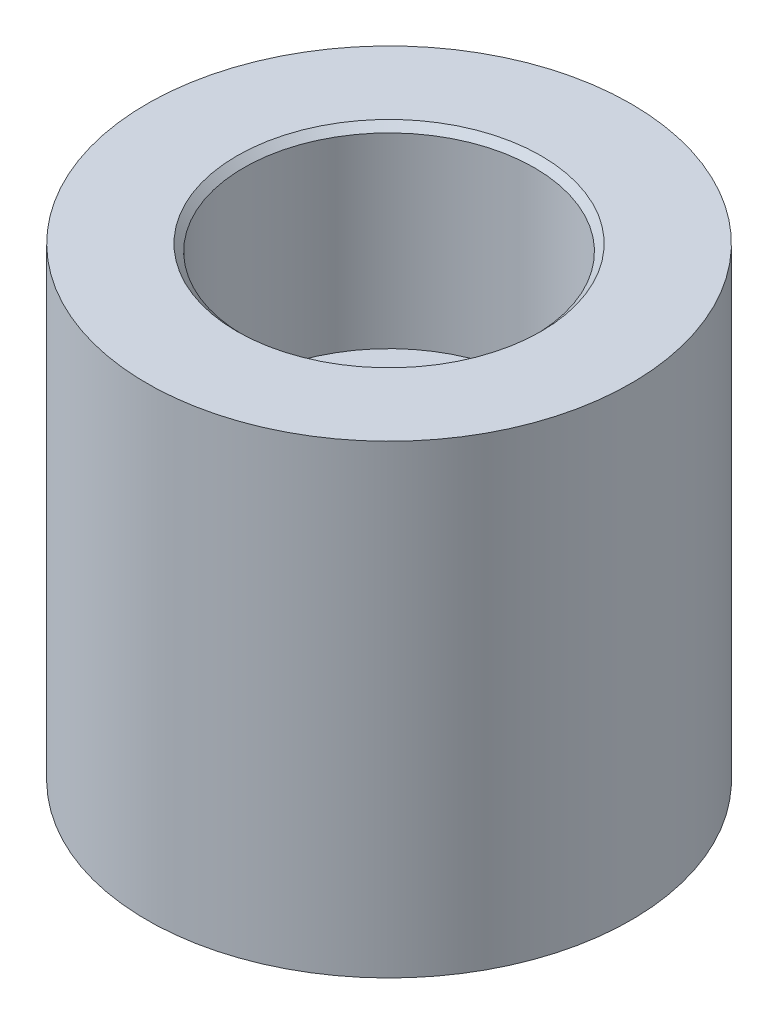
ISO-10303-21;
HEADER;
FILE_DESCRIPTION(('STEP AP214'),'2;1');
FILE_NAME('part.step','',(''),(''),'','','');
FILE_SCHEMA(('AUTOMOTIVE_DESIGN { 1 0 10303 214 1 1 1 1 }'));
ENDSEC;
DATA;
#1=APPLICATION_CONTEXT('core data for automotive mechanical design processes');
#2=APPLICATION_PROTOCOL_DEFINITION('international standard','automotive_design',2000,#1);
#3=PRODUCT_CONTEXT('',#1,'mechanical');
#4=PRODUCT('Part','Part','',(#3));
#5=PRODUCT_RELATED_PRODUCT_CATEGORY('part','',(#4));
#6=PRODUCT_DEFINITION_FORMATION('','',#4);
#7=PRODUCT_DEFINITION_CONTEXT('part definition',#1,'design');
#8=PRODUCT_DEFINITION('design','',#6,#7);
#9=PRODUCT_DEFINITION_SHAPE('','',#8);
#10=(LENGTH_UNIT() NAMED_UNIT(*) SI_UNIT(.MILLI.,.METRE.));
#11=(NAMED_UNIT(*) PLANE_ANGLE_UNIT() SI_UNIT($,.RADIAN.));
#12=(NAMED_UNIT(*) SI_UNIT($,.STERADIAN.) SOLID_ANGLE_UNIT());
#13=UNCERTAINTY_MEASURE_WITH_UNIT(LENGTH_MEASURE(1.E-05),#10,'distance_accuracy_value','');
#14=(GEOMETRIC_REPRESENTATION_CONTEXT(3) GLOBAL_UNCERTAINTY_ASSIGNED_CONTEXT((#13)) GLOBAL_UNIT_ASSIGNED_CONTEXT((#10,
#11,#12)) REPRESENTATION_CONTEXT('',''));
#15=CARTESIAN_POINT('',(0.,0.,0.));
#16=DIRECTION('',(0.,0.,1.));
#17=DIRECTION('',(1.,0.,0.));
#18=AXIS2_PLACEMENT_3D('',#15,#16,#17);
#19=CARTESIAN_POINT('',(0.,0.,0.));
#20=DIRECTION('',(0.,-1.,0.));
#21=DIRECTION('',(0.,0.,-1.));
#22=AXIS2_PLACEMENT_3D('',#19,#20,#21);
#23=PLANE('',#22);
#24=CARTESIAN_POINT('',(0.,0.,0.));
#25=DIRECTION('',(0.,-1.,0.));
#26=DIRECTION('',(0.,0.,-1.));
#27=AXIS2_PLACEMENT_3D('',#24,#25,#26);
#28=CIRCLE('',#27,3.);
#29=CARTESIAN_POINT('',(0.,0.,3.));
#30=VERTEX_POINT('',#29);
#31=EDGE_CURVE('E62',#30,#30,#28,.T.);
#32=ORIENTED_EDGE('',*,*,#31,.F.);
#33=EDGE_LOOP('',(#32));
#34=FACE_BOUND('',#33,.T.);
#35=CARTESIAN_POINT('',(0.,0.,0.));
#36=DIRECTION('',(0.,-1.,0.));
#37=DIRECTION('',(0.,0.,-1.));
#38=AXIS2_PLACEMENT_3D('',#35,#36,#37);
#39=CIRCLE('',#38,25.);
#40=CARTESIAN_POINT('',(0.,0.,-25.));
#41=VERTEX_POINT('',#40);
#42=EDGE_CURVE('E10',#41,#41,#39,.T.);
#43=ORIENTED_EDGE('',*,*,#42,.T.);
#44=EDGE_LOOP('',(#43));
#45=FACE_BOUND('',#44,.T.);
#46=ADVANCED_FACE('F32',(#34,#45),#23,.T.);
#47=CARTESIAN_POINT('',(0.,0.,0.));
#48=DIRECTION('',(0.,-1.,0.));
#49=DIRECTION('',(0.,0.,-1.));
#50=AXIS2_PLACEMENT_3D('',#47,#48,#49);
#51=CYLINDRICAL_SURFACE('',#50,25.);
#52=CARTESIAN_POINT('',(0.,25.,-25.));
#53=CARTESIAN_POINT('',(0.0561463470094441,24.9999975176159,-24.9999997313602));
#54=CARTESIAN_POINT('',(0.112332833424932,24.995255505283,-24.9998088276411));
#55=CARTESIAN_POINT('',(0.223156749052394,24.9764054068759,-24.9990656273066));
#56=CARTESIAN_POINT('',(0.27779225851355,24.9622861996402,-24.998512901589));
#57=CARTESIAN_POINT('',(0.383892729566534,24.9250857771377,-24.9971086364703));
#58=CARTESIAN_POINT('',(0.435359255781934,24.9020090262648,-24.9962572459427));
#59=CARTESIAN_POINT('',(0.533673799900105,24.8475551871666,-24.9943516214774));
#60=CARTESIAN_POINT('',(0.580522925234626,24.8161800958872,-24.9932974363577));
#61=CARTESIAN_POINT('',(0.668319730976189,24.7459953171078,-24.9911040507558));
#62=CARTESIAN_POINT('',(0.709263831785767,24.7071811529993,-24.9899647993365));
#63=CARTESIAN_POINT('',(0.784057976647897,24.6232285494857,-24.9877301253061));
#64=CARTESIAN_POINT('',(0.817907735030962,24.5780898555315,-24.9866347044614));
#65=CARTESIAN_POINT('',(0.877560633846625,24.4827527390268,-24.9846108975087));
#66=CARTESIAN_POINT('',(0.903361216107984,24.4325527145891,-24.9836825645437));
#67=CARTESIAN_POINT('',(0.946166894307623,24.3285292578572,-24.9820981836086));
#68=CARTESIAN_POINT('',(0.963172039265135,24.274705845759,-24.9814421341209));
#69=CARTESIAN_POINT('',(0.987895315988766,24.1649942522482,-24.9804767258822));
#70=CARTESIAN_POINT('',(0.995618458082538,24.1091072015744,-24.9801671800983));
#71=CARTESIAN_POINT('',(1.00157394685459,23.996829089005,-24.9799291218785));
#72=CARTESIAN_POINT('',(0.999806347602293,23.9404380299826,-24.9800006072718));
#73=CARTESIAN_POINT('',(0.986834724932466,23.828786646534,-24.9805163761421));
#74=CARTESIAN_POINT('',(0.975636113097927,23.7735256922676,-24.980960445827));
#75=CARTESIAN_POINT('',(0.944128732235828,23.6656686920144,-24.9821709906939));
#76=CARTESIAN_POINT('',(0.923819935067671,23.6130726542598,-24.9829374668716));
#77=CARTESIAN_POINT('',(0.874662475725015,23.512021054563,-24.984706674276));
#78=CARTESIAN_POINT('',(0.845811338696029,23.4635666977829,-24.9857094739521));
#79=CARTESIAN_POINT('',(0.780389994201206,23.3721870976351,-24.9878382210831));
#80=CARTESIAN_POINT('',(0.743819752971197,23.3292618784537,-24.9889641690765));
#81=CARTESIAN_POINT('',(0.663967716987967,23.2501275341749,-24.9912132459231));
#82=CARTESIAN_POINT('',(0.6206812332783,23.2139231403181,-24.9923363722453));
#83=CARTESIAN_POINT('',(0.528641967868965,23.1492945958165,-24.9944524442096));
#84=CARTESIAN_POINT('',(0.479889185106713,23.1208704466841,-24.9954453898264));
#85=CARTESIAN_POINT('',(0.378298541270231,23.0726097426589,-24.9971892059437));
#86=CARTESIAN_POINT('',(0.325460606015092,23.0527733437513,-24.9979400720472));
#87=CARTESIAN_POINT('',(0.217200734080876,23.0222542746375,-24.9991150279319));
#88=CARTESIAN_POINT('',(0.161778809820877,23.0115715604419,-24.9995391192834));
#89=CARTESIAN_POINT('',(0.0499652802237737,22.9996689161786,-25.0000125231353));
#90=CARTESIAN_POINT('',(-0.00642562727268167,22.9984424404356,-25.0000620948804));
#91=CARTESIAN_POINT('',(-0.118612500067988,23.0054700197227,-24.9997815595425));
#92=CARTESIAN_POINT('',(-0.174408466614514,23.013724054867,-24.9994514532559));
#93=CARTESIAN_POINT('',(-0.283803326228708,23.0394729368111,-24.9984489221807));
#94=CARTESIAN_POINT('',(-0.337402921674786,23.0569648041937,-24.9977766077646));
#95=CARTESIAN_POINT('',(-0.440905142316235,23.1006897999788,-24.9961653908243));
#96=CARTESIAN_POINT('',(-0.490807753993521,23.1269229603421,-24.9952264873253));
#97=CARTESIAN_POINT('',(-0.585529553929883,23.1874026937278,-24.9931871502773));
#98=CARTESIAN_POINT('',(-0.630345932241639,23.2216536645894,-24.9920866282028));
#99=CARTESIAN_POINT('',(-0.713594858215399,23.2971903167056,-24.9898483398823));
#100=CARTESIAN_POINT('',(-0.752027378818251,23.3384760277769,-24.9887105734784));
#101=CARTESIAN_POINT('',(-0.821439572007103,23.426938310698,-24.9865253115002));
#102=CARTESIAN_POINT('',(-0.852415016371307,23.4741182016762,-24.9854778673544));
#103=CARTESIAN_POINT('',(-0.906004883239562,23.5730127324744,-24.9835921606171));
#104=CARTESIAN_POINT('',(-0.928619332294777,23.6247273578932,-24.9827538973615));
#105=CARTESIAN_POINT('',(-0.964837868903378,23.7312075619123,-24.9813814381553));
#106=CARTESIAN_POINT('',(-0.978444674332901,23.7859722148159,-24.9808471504932));
#107=CARTESIAN_POINT('',(-0.99627057538689,23.8970109362245,-24.9801426284087));
#108=CARTESIAN_POINT('',(-1.00048969893352,23.9532850002394,-24.9799723929035));
#109=CARTESIAN_POINT('',(-0.999420163736354,24.0657029622006,-24.9800152025847));
#110=CARTESIAN_POINT('',(-0.994138162655541,24.121846923712,-24.9802279793854));
#111=CARTESIAN_POINT('',(-0.974230044573727,24.2324504101321,-24.9810122634766));
#112=CARTESIAN_POINT('',(-0.959603909324686,24.286909931751,-24.9815837714677));
#113=CARTESIAN_POINT('',(-0.921423905585137,24.3926004504634,-24.9830210439361));
#114=CARTESIAN_POINT('',(-0.897869916196183,24.4438314038255,-24.9838868123981));
#115=CARTESIAN_POINT('',(-0.842504329174852,24.5416113829738,-24.9858149827055));
#116=CARTESIAN_POINT('',(-0.810693010318196,24.5881605667476,-24.9868773779123));
#117=CARTESIAN_POINT('',(-0.739693250839156,24.6752880639909,-24.9890798659209));
#118=CARTESIAN_POINT('',(-0.700500445115082,24.7158628190066,-24.9902200044412));
#119=CARTESIAN_POINT('',(-0.615847951555446,24.789868531044,-24.9924492609827));
#120=CARTESIAN_POINT('',(-0.570386718797408,24.8232977217674,-24.9935383663374));
#121=CARTESIAN_POINT('',(-0.474462283968507,24.8820733714382,-24.9955433471776));
#122=CARTESIAN_POINT('',(-0.423995193983452,24.9074134823589,-24.9964590863834));
#123=CARTESIAN_POINT('',(-0.319557682502352,24.9492311073446,-24.9980118993903));
#124=CARTESIAN_POINT('',(-0.265591507180326,24.9657191459669,-24.9986493039447));
#125=CARTESIAN_POINT('',(-0.176072381939816,24.9850146015918,-24.9994040397947));
#126=CARTESIAN_POINT('',(-0.141099965379224,24.9906270099653,-24.9996265497353));
#127=CARTESIAN_POINT('',(-0.0707570138029636,24.9981204904409,-24.9999246144544));
#128=CARTESIAN_POINT('',(-0.0353864789996701,25.0000015645334,-25.0000001693114));
#129=CARTESIAN_POINT('',(0.,25.,-25.));
#130=B_SPLINE_CURVE_WITH_KNOTS('',3,(#52,#53,#54,#55,#56,#57,#58,#59,#60,#61,#62,#63,#64,#65,
#66,#67,#68,#69,#70,#71,#72,#73,#74,#75,#76,#77,#78,#79,#80,#81,#82,#83,#84,#85,#86,#87,#88,#89,
#90,#91,#92,#93,#94,#95,#96,#97,#98,#99,#100,#101,#102,#103,#104,#105,#106,#107,#108,#109,#110,
#111,#112,#113,#114,#115,#116,#117,#118,#119,#120,#121,#122,#123,#124,#125,#126,#127,#128,#129),
.UNSPECIFIED.,.T.,.F.,(4,2,2,2,2,2,2,2,2,2,2,2,2,2,2,2,2,2,2,2,2,2,2,2,2,2,2,2,2,2,2,2,2,2,2,2,
2,2,4),(0.,0.168309872050768,0.33681971347493,0.505245678065891,0.673631148775728,
0.842118268730383,1.01061217189096,1.17915957098391,1.34770603070878,1.51616146990403,
1.68461594939788,1.85297383430525,2.02133223925958,2.18973946818306,2.35814743375269,
2.52667350711562,2.69519961323808,2.86372878028851,3.03225713744351,3.20066882759334,
3.36908016449051,3.53743721792812,3.70579488693583,3.87424511887733,4.0426960648078,
4.21124229999202,4.37978799993649,4.54828282138275,4.71677714166731,4.88515343998267,
5.05353006711894,5.22190897444477,5.39028219786908,5.55875530458004,5.72727000779883,
5.89591663219319,6.06436229980936,6.17044038408392,6.27651841177395),.UNSPECIFIED.);
#131=CARTESIAN_POINT('',(0.,25.,-25.));
#132=VERTEX_POINT('',#131);
#133=EDGE_CURVE('E70',#132,#132,#130,.T.);
#134=ORIENTED_EDGE('',*,*,#133,.F.);
#135=EDGE_LOOP('',(#134));
#136=FACE_BOUND('',#135,.T.);
#137=CARTESIAN_POINT('',(0.,48.,0.));
#138=DIRECTION('',(0.,-1.,0.));
#139=DIRECTION('',(0.,0.,-1.));
#140=AXIS2_PLACEMENT_3D('',#137,#138,#139);
#141=CIRCLE('',#140,25.);
#142=CARTESIAN_POINT('',(0.,48.,-25.));
#143=VERTEX_POINT('',#142);
#144=EDGE_CURVE('E43',#143,#143,#141,.T.);
#145=ORIENTED_EDGE('',*,*,#144,.T.);
#146=EDGE_LOOP('',(#145));
#147=FACE_BOUND('',#146,.T.);
#148=ORIENTED_EDGE('',*,*,#42,.F.);
#149=EDGE_LOOP('',(#148));
#150=FACE_BOUND('',#149,.T.);
#151=ADVANCED_FACE('F74',(#136,#147,#150),#51,.T.);
#152=CARTESIAN_POINT('',(25.,48.,0.));
#153=DIRECTION('',(0.,1.,0.));
#154=DIRECTION('',(0.,0.,1.));
#155=AXIS2_PLACEMENT_3D('',#152,#153,#154);
#156=PLANE('',#155);
#157=CARTESIAN_POINT('',(0.,48.,0.));
#158=DIRECTION('',(0.,-1.,0.));
#159=DIRECTION('',(0.,0.,-1.));
#160=AXIS2_PLACEMENT_3D('',#157,#158,#159);
#161=CIRCLE('',#160,15.7071067811865);
#162=CARTESIAN_POINT('',(0.,48.,-15.7071067811865));
#163=VERTEX_POINT('',#162);
#164=EDGE_CURVE('E47',#163,#163,#161,.T.);
#165=ORIENTED_EDGE('',*,*,#164,.T.);
#166=EDGE_LOOP('',(#165));
#167=FACE_BOUND('',#166,.T.);
#168=ORIENTED_EDGE('',*,*,#144,.F.);
#169=EDGE_LOOP('',(#168));
#170=FACE_BOUND('',#169,.T.);
#171=ADVANCED_FACE('F105',(#167,#170),#156,.T.);
#172=CARTESIAN_POINT('',(0.,48.,0.));
#173=DIRECTION('',(0.,1.,0.));
#174=DIRECTION('',(0.,0.,1.));
#175=AXIS2_PLACEMENT_3D('',#172,#173,#174);
#176=CONICAL_SURFACE('',#175,15.7071067811865,0.785398163397452);
#177=CARTESIAN_POINT('',(0.,47.2928932188134,0.));
#178=DIRECTION('',(0.,-1.,0.));
#179=DIRECTION('',(0.,0.,-1.));
#180=AXIS2_PLACEMENT_3D('',#177,#178,#179);
#181=CIRCLE('',#180,15.);
#182=CARTESIAN_POINT('',(0.,47.2928932188134,-15.));
#183=VERTEX_POINT('',#182);
#184=EDGE_CURVE('E52',#183,#183,#181,.T.);
#185=ORIENTED_EDGE('',*,*,#184,.T.);
#186=EDGE_LOOP('',(#185));
#187=FACE_BOUND('',#186,.T.);
#188=ORIENTED_EDGE('',*,*,#164,.F.);
#189=EDGE_LOOP('',(#188));
#190=FACE_BOUND('',#189,.T.);
#191=ADVANCED_FACE('F102',(#187,#190),#176,.F.);
#192=CARTESIAN_POINT('',(0.,0.,0.));
#193=DIRECTION('',(0.,-1.,0.));
#194=DIRECTION('',(0.,0.,-1.));
#195=AXIS2_PLACEMENT_3D('',#192,#193,#194);
#196=CYLINDRICAL_SURFACE('',#195,15.);
#197=CARTESIAN_POINT('',(0.,28.,0.));
#198=DIRECTION('',(0.,-1.,0.));
#199=DIRECTION('',(0.,0.,-1.));
#200=AXIS2_PLACEMENT_3D('',#197,#198,#199);
#201=CIRCLE('',#200,15.);
#202=CARTESIAN_POINT('',(0.,28.,-15.));
#203=VERTEX_POINT('',#202);
#204=EDGE_CURVE('E55',#203,#203,#201,.T.);
#205=ORIENTED_EDGE('',*,*,#204,.T.);
#206=EDGE_LOOP('',(#205));
#207=FACE_BOUND('',#206,.T.);
#208=ORIENTED_EDGE('',*,*,#184,.F.);
#209=EDGE_LOOP('',(#208));
#210=FACE_BOUND('',#209,.T.);
#211=ADVANCED_FACE('F98',(#207,#210),#196,.F.);
#212=CARTESIAN_POINT('',(15.,28.,0.));
#213=DIRECTION('',(0.,1.,0.));
#214=DIRECTION('',(0.,0.,1.));
#215=AXIS2_PLACEMENT_3D('',#212,#213,#214);
#216=PLANE('',#215);
#217=CARTESIAN_POINT('',(0.,28.,0.));
#218=DIRECTION('',(0.,1.,0.));
#219=DIRECTION('',(0.,0.,1.));
#220=AXIS2_PLACEMENT_3D('',#217,#218,#219);
#221=CIRCLE('',#220,5.);
#222=CARTESIAN_POINT('',(0.,28.,5.));
#223=VERTEX_POINT('',#222);
#224=EDGE_CURVE('E59',#223,#223,#221,.T.);
#225=ORIENTED_EDGE('',*,*,#224,.F.);
#226=EDGE_LOOP('',(#225));
#227=FACE_BOUND('',#226,.T.);
#228=ORIENTED_EDGE('',*,*,#204,.F.);
#229=EDGE_LOOP('',(#228));
#230=FACE_BOUND('',#229,.T.);
#231=ADVANCED_FACE('F94',(#227,#230),#216,.T.);
#232=CARTESIAN_POINT('',(0.,20.,0.));
#233=DIRECTION('',(0.,1.,0.));
#234=DIRECTION('',(0.,0.,1.));
#235=AXIS2_PLACEMENT_3D('',#232,#233,#234);
#236=CYLINDRICAL_SURFACE('',#235,5.);
#237=CARTESIAN_POINT('',(1.,24.,-4.89897948556636));
#238=CARTESIAN_POINT('',(0.999997945876046,23.944435624518,-4.89898059043933));
#239=CARTESIAN_POINT('',(0.995353171723657,23.8888453766935,-4.89993508346913));
#240=CARTESIAN_POINT('',(0.976912283588335,23.7792374948816,-4.90364431385263));
#241=CARTESIAN_POINT('',(0.963108847071181,23.7252211553689,-4.90640049166333));
#242=CARTESIAN_POINT('',(0.926795782617738,23.6203626966371,-4.91338873700356));
#243=CARTESIAN_POINT('',(0.904294814152082,23.5695174784651,-4.91761933615313));
#244=CARTESIAN_POINT('',(0.851249107671041,23.4723251553054,-4.92707799486421));
#245=CARTESIAN_POINT('',(0.820704818601294,23.4259777994627,-4.93230599875014));
#246=CARTESIAN_POINT('',(0.751979075653287,23.3384389961455,-4.9432529969268));
#247=CARTESIAN_POINT('',(0.713705655913277,23.2973204121159,-4.94897737836825));
#248=CARTESIAN_POINT('',(0.630806789021348,23.2220424664212,-4.9602247230302));
#249=CARTESIAN_POINT('',(0.586180896977994,23.1878835925828,-4.96574767210945));
#250=CARTESIAN_POINT('',(0.491361355924245,23.1272119823715,-4.97602796417448));
#251=CARTESIAN_POINT('',(0.441122567672207,23.1007684861833,-4.9807782144152));
#252=CARTESIAN_POINT('',(0.336804150387274,23.0567250629519,-4.98891736883662));
#253=CARTESIAN_POINT('',(0.282724881420553,23.039124308099,-4.99230640044127));
#254=CARTESIAN_POINT('',(0.173016773278493,23.0134928063804,-4.9973032068841));
#255=CARTESIAN_POINT('',(0.117417739214813,23.005339022429,-4.99893386288125));
#256=CARTESIAN_POINT('',(0.00561856843753573,22.9984490481617,-5.00030921183606));
#257=CARTESIAN_POINT('',(-0.0505815098318436,22.9997119503542,-5.00005408652759));
#258=CARTESIAN_POINT('',(-0.161142000743589,23.0115261802156,-4.99770434868515));
#259=CARTESIAN_POINT('',(-0.215517214298471,23.0219449771678,-4.99563598365838));
#260=CARTESIAN_POINT('',(-0.321731626580301,23.0515650324589,-4.98992177159409));
#261=CARTESIAN_POINT('',(-0.373570723747128,23.0707666421919,-4.98627586144039));
#262=CARTESIAN_POINT('',(-0.473619463200887,23.1175300401473,-4.97777296019958));
#263=CARTESIAN_POINT('',(-0.5218041741339,23.1451437511049,-4.97290848175223));
#264=CARTESIAN_POINT('',(-0.612905045859757,23.2079090772366,-4.96250469473785));
#265=CARTESIAN_POINT('',(-0.655820599525001,23.2430615597705,-4.95696530855222));
#266=CARTESIAN_POINT('',(-0.735951431053458,23.3206336221085,-4.9457096436446));
#267=CARTESIAN_POINT('',(-0.773054316573632,23.3631691867296,-4.93999196457516));
#268=CARTESIAN_POINT('',(-0.839618493176808,23.4539164424508,-4.92911571598761));
#269=CARTESIAN_POINT('',(-0.869079639727751,23.5021282408832,-4.92395715704548));
#270=CARTESIAN_POINT('',(-0.919562814801881,23.6030208318218,-4.91478047472924));
#271=CARTESIAN_POINT('',(-0.940566647777709,23.6557109676397,-4.91076481563549));
#272=CARTESIAN_POINT('',(-0.973390341627582,23.763971323724,-4.90436476321273));
#273=CARTESIAN_POINT('',(-0.985211399456642,23.8195411676191,-4.90198015728428));
#274=CARTESIAN_POINT('',(-0.999166006036051,23.930964857999,-4.89915479267828));
#275=CARTESIAN_POINT('',(-1.00146185889791,23.9867975743103,-4.89868147057154));
#276=CARTESIAN_POINT('',(-0.996737628310739,24.0980482231997,-4.89964485688854));
#277=CARTESIAN_POINT('',(-0.989718073122443,24.1534661791189,-4.90108145700388));
#278=CARTESIAN_POINT('',(-0.966702208074158,24.2617686402922,-4.90567232494914));
#279=CARTESIAN_POINT('',(-0.950792620839299,24.3146723430358,-4.90880999014497));
#280=CARTESIAN_POINT('',(-0.910541035308518,24.4170632790287,-4.91643489351665));
#281=CARTESIAN_POINT('',(-0.886198342373177,24.4665502304357,-4.9209222428627));
#282=CARTESIAN_POINT('',(-0.829404142215598,24.5614131099502,-4.93081405962039));
#283=CARTESIAN_POINT('',(-0.796851077982754,24.6067270463008,-4.93622971864903));
#284=CARTESIAN_POINT('',(-0.724695572212713,24.6913083120009,-4.94733723826636));
#285=CARTESIAN_POINT('',(-0.685092405144538,24.7305750182493,-4.95302912723818));
#286=CARTESIAN_POINT('',(-0.599232273497891,24.8025625591856,-4.96415345869216));
#287=CARTESIAN_POINT('',(-0.55288249892963,24.83517365465,-4.96958057708684));
#288=CARTESIAN_POINT('',(-0.455267896634756,24.8921458814996,-4.9794712762862));
#289=CARTESIAN_POINT('',(-0.404003275433507,24.9165073593448,-4.98393489755211));
#290=CARTESIAN_POINT('',(-0.298302680824013,24.9561288717466,-4.99137294061067));
#291=CARTESIAN_POINT('',(-0.243886673478077,24.9714405182263,-4.99435579142604));
#292=CARTESIAN_POINT('',(-0.133189454679911,24.9926912476638,-4.9985323593766));
#293=CARTESIAN_POINT('',(-0.0769084687112131,24.9986314594757,-4.99972629199843));
#294=CARTESIAN_POINT('',(0.0348728939036241,25.0009269809629,-5.00018540454121));
#295=CARTESIAN_POINT('',(0.090369812141503,24.9974472804562,-4.99948378549351));
#296=CARTESIAN_POINT('',(0.199971031315642,24.9813660494522,-4.99630043560318));
#297=CARTESIAN_POINT('',(0.254075349753691,24.9687646336519,-4.99381872714351));
#298=CARTESIAN_POINT('',(0.359252749745096,24.9348710079084,-4.98735498365001));
#299=CARTESIAN_POINT('',(0.410332443240281,24.9135986218688,-4.98337637247912));
#300=CARTESIAN_POINT('',(0.508221220185952,24.8629877586691,-4.97434722123382));
#301=CARTESIAN_POINT('',(0.555029965767411,24.8336486440963,-4.96929659645878));
#302=CARTESIAN_POINT('',(0.643863890106357,24.7671806129379,-4.95857599157868));
#303=CARTESIAN_POINT('',(0.685799716116502,24.7299336636132,-4.95289733422142));
#304=CARTESIAN_POINT('',(0.762882617756845,24.6489497599042,-4.94161222903622));
#305=CARTESIAN_POINT('',(0.798028083202712,24.6052112705313,-4.93600579862875));
#306=CARTESIAN_POINT('',(0.860892219455201,24.5119206832998,-4.92543342749964));
#307=CARTESIAN_POINT('',(0.888526814639767,24.4623110388396,-4.92047503631328));
#308=CARTESIAN_POINT('',(0.935024049287809,24.3590672267003,-4.91185237184445));
#309=CARTESIAN_POINT('',(0.95389464597929,24.3054367613021,-4.90818692536957));
#310=CARTESIAN_POINT('',(0.978669139854273,24.2097375445634,-4.90329681128922));
#311=CARTESIAN_POINT('',(0.986653898522986,24.1682145804885,-4.90168784915661));
#312=CARTESIAN_POINT('',(0.99732001796041,24.0844660454464,-4.8995287845803));
#313=CARTESIAN_POINT('',(1.00000156156206,24.0422404987518,-4.89897864563277));
#314=CARTESIAN_POINT('',(1.,24.,-4.89897948556636));
#315=B_SPLINE_CURVE_WITH_KNOTS('',3,(#237,#238,#239,#240,#241,#242,#243,#244,#245,#246,#247,
#248,#249,#250,#251,#252,#253,#254,#255,#256,#257,#258,#259,#260,#261,#262,#263,#264,#265,#266,
#267,#268,#269,#270,#271,#272,#273,#274,#275,#276,#277,#278,#279,#280,#281,#282,#283,#284,#285,
#286,#287,#288,#289,#290,#291,#292,#293,#294,#295,#296,#297,#298,#299,#300,#301,#302,#303,#304,
#305,#306,#307,#308,#309,#310,#311,#312,#313,#314),.UNSPECIFIED.,.T.,.F.,(4,2,2,2,2,2,2,2,2,2,2,
2,2,2,2,2,2,2,2,2,2,2,2,2,2,2,2,2,2,2,2,2,2,2,2,2,2,2,4),(0.,0.166538463856527,
0.333210239259265,0.49971649791556,0.666213464834835,0.834822525459338,1.00344340032919,
1.17353400434947,1.34360868244057,1.51144248880577,1.67926012113745,1.84468789631034,
2.01012229071247,2.176599242198,2.34309535767563,2.5124934675998,2.68189478120217,
2.85165863170273,3.02140035013521,3.1882375780209,3.35506534525918,3.52029341780816,
3.68553510351895,3.85293059772018,4.02034332867706,4.19032601730947,4.36030156627602,
4.52929813576147,4.69827434689125,4.86431017412183,5.03034391364254,5.19600017072949,
5.36166952132181,5.53001152023093,5.69839338887278,5.86858898576538,6.0386297508643,
6.16523803634393,6.29184195681712),.UNSPECIFIED.);
#316=CARTESIAN_POINT('',(1.,24.,-4.89897948556636));
#317=VERTEX_POINT('',#316);
#318=EDGE_CURVE('E35',#317,#317,#315,.T.);
#319=ORIENTED_EDGE('',*,*,#318,.T.);
#320=EDGE_LOOP('',(#319));
#321=FACE_BOUND('',#320,.T.);
#322=CARTESIAN_POINT('',(0.,20.,0.));
#323=DIRECTION('',(0.,1.,0.));
#324=DIRECTION('',(0.,0.,1.));
#325=AXIS2_PLACEMENT_3D('',#322,#323,#324);
#326=CIRCLE('',#325,5.);
#327=CARTESIAN_POINT('',(0.,20.,5.));
#328=VERTEX_POINT('',#327);
#329=EDGE_CURVE('E58',#328,#328,#326,.T.);
#330=ORIENTED_EDGE('',*,*,#329,.F.);
#331=EDGE_LOOP('',(#330));
#332=FACE_BOUND('',#331,.T.);
#333=ORIENTED_EDGE('',*,*,#224,.T.);
#334=EDGE_LOOP('',(#333));
#335=FACE_BOUND('',#334,.T.);
#336=ADVANCED_FACE('F89',(#321,#332,#335),#236,.F.);
#337=CARTESIAN_POINT('',(0.,20.,0.));
#338=DIRECTION('',(0.,1.,0.));
#339=DIRECTION('',(0.,0.,1.));
#340=AXIS2_PLACEMENT_3D('',#337,#338,#339);
#341=PLANE('',#340);
#342=CARTESIAN_POINT('',(0.,20.,0.));
#343=DIRECTION('',(0.,1.,0.));
#344=DIRECTION('',(0.,0.,1.));
#345=AXIS2_PLACEMENT_3D('',#342,#343,#344);
#346=CIRCLE('',#345,3.);
#347=CARTESIAN_POINT('',(0.,20.,3.));
#348=VERTEX_POINT('',#347);
#349=EDGE_CURVE('E67',#348,#348,#346,.T.);
#350=ORIENTED_EDGE('',*,*,#349,.F.);
#351=EDGE_LOOP('',(#350));
#352=FACE_BOUND('',#351,.T.);
#353=ORIENTED_EDGE('',*,*,#329,.T.);
#354=EDGE_LOOP('',(#353));
#355=FACE_BOUND('',#354,.T.);
#356=ADVANCED_FACE('F86',(#352,#355),#341,.T.);
#357=CARTESIAN_POINT('',(0.,-28.,0.));
#358=DIRECTION('',(0.,1.,0.));
#359=DIRECTION('',(0.,0.,1.));
#360=AXIS2_PLACEMENT_3D('',#357,#358,#359);
#361=CYLINDRICAL_SURFACE('',#360,3.);
#362=CARTESIAN_POINT('',(0.,0.,3.));
#363=CARTESIAN_POINT('',(0.,0.208333333333337,3.));
#364=CARTESIAN_POINT('',(0.,0.416666666666671,3.));
#365=CARTESIAN_POINT('',(0.,0.833333333333337,3.));
#366=CARTESIAN_POINT('',(0.,1.04166666666667,3.));
#367=CARTESIAN_POINT('',(0.,1.45833333333334,3.));
#368=CARTESIAN_POINT('',(0.,1.66666666666667,3.));
#369=CARTESIAN_POINT('',(0.,2.08333333333334,3.));
#370=CARTESIAN_POINT('',(0.,2.29166666666667,3.));
#371=CARTESIAN_POINT('',(0.,2.70833333333334,3.));
#372=CARTESIAN_POINT('',(0.,2.91666666666667,3.));
#373=CARTESIAN_POINT('',(0.,3.33333333333333,3.));
#374=CARTESIAN_POINT('',(0.,3.54166666666667,3.));
#375=CARTESIAN_POINT('',(0.,3.95833333333333,3.));
#376=CARTESIAN_POINT('',(0.,4.16666666666666,3.));
#377=CARTESIAN_POINT('',(0.,4.58333333333333,3.));
#378=CARTESIAN_POINT('',(0.,4.79166666666666,3.));
#379=CARTESIAN_POINT('',(0.,5.20833333333333,3.));
#380=CARTESIAN_POINT('',(0.,5.41666666666666,3.));
#381=CARTESIAN_POINT('',(0.,5.83333333333333,3.));
#382=CARTESIAN_POINT('',(0.,6.04166666666667,3.));
#383=CARTESIAN_POINT('',(0.,6.45833333333333,3.));
#384=CARTESIAN_POINT('',(0.,6.66666666666667,3.));
#385=CARTESIAN_POINT('',(0.,7.08333333333333,3.));
#386=CARTESIAN_POINT('',(0.,7.29166666666667,3.));
#387=CARTESIAN_POINT('',(0.,7.70833333333333,3.));
#388=CARTESIAN_POINT('',(0.,7.91666666666667,3.));
#389=CARTESIAN_POINT('',(0.,8.33333333333333,3.));
#390=CARTESIAN_POINT('',(0.,8.54166666666667,3.));
#391=CARTESIAN_POINT('',(0.,8.95833333333333,3.));
#392=CARTESIAN_POINT('',(0.,9.16666666666667,3.));
#393=CARTESIAN_POINT('',(0.,9.58333333333333,3.));
#394=CARTESIAN_POINT('',(0.,9.79166666666667,3.));
#395=CARTESIAN_POINT('',(0.,10.2083333333333,3.));
#396=CARTESIAN_POINT('',(0.,10.4166666666667,3.));
#397=CARTESIAN_POINT('',(0.,10.8333333333333,3.));
#398=CARTESIAN_POINT('',(0.,11.0416666666667,3.));
#399=CARTESIAN_POINT('',(0.,11.4583333333333,3.));
#400=CARTESIAN_POINT('',(0.,11.6666666666667,3.));
#401=CARTESIAN_POINT('',(0.,12.0833333333333,3.));
#402=CARTESIAN_POINT('',(0.,12.2916666666667,3.));
#403=CARTESIAN_POINT('',(0.,12.7083333333333,3.));
#404=CARTESIAN_POINT('',(0.,12.9166666666667,3.));
#405=CARTESIAN_POINT('',(0.,13.3333333333333,3.));
#406=CARTESIAN_POINT('',(0.,13.5416666666667,3.));
#407=CARTESIAN_POINT('',(0.,13.9583333333333,3.));
#408=CARTESIAN_POINT('',(0.,14.1666666666667,3.));
#409=CARTESIAN_POINT('',(0.,14.5833333333333,3.));
#410=CARTESIAN_POINT('',(0.,14.7916666666667,3.));
#411=CARTESIAN_POINT('',(0.,15.2083333333333,3.));
#412=CARTESIAN_POINT('',(0.,15.4166666666667,3.));
#413=CARTESIAN_POINT('',(0.,15.8333333333333,3.));
#414=CARTESIAN_POINT('',(0.,16.0416666666667,3.));
#415=CARTESIAN_POINT('',(0.,16.4583333333333,3.));
#416=CARTESIAN_POINT('',(0.,16.6666666666667,3.));
#417=CARTESIAN_POINT('',(0.,17.0833333333333,3.));
#418=CARTESIAN_POINT('',(0.,17.2916666666667,3.));
#419=CARTESIAN_POINT('',(0.,17.7083333333333,3.));
#420=CARTESIAN_POINT('',(0.,17.9166666666667,3.));
#421=CARTESIAN_POINT('',(0.,18.3333333333333,3.));
#422=CARTESIAN_POINT('',(0.,18.5416666666667,3.));
#423=CARTESIAN_POINT('',(0.,18.9583333333333,3.));
#424=CARTESIAN_POINT('',(0.,19.1666666666667,3.));
#425=CARTESIAN_POINT('',(0.,19.5833333333333,3.));
#426=CARTESIAN_POINT('',(0.,19.7916666666667,3.));
#427=CARTESIAN_POINT('',(0.,20.,3.));
#428=B_SPLINE_CURVE_WITH_KNOTS('',3,(#362,#363,#364,#365,#366,#367,#368,#369,#370,#371,#372,
#373,#374,#375,#376,#377,#378,#379,#380,#381,#382,#383,#384,#385,#386,#387,#388,#389,#390,#391,
#392,#393,#394,#395,#396,#397,#398,#399,#400,#401,#402,#403,#404,#405,#406,#407,#408,#409,#410,
#411,#412,#413,#414,#415,#416,#417,#418,#419,#420,#421,#422,#423,#424,#425,#426,#427),
.UNSPECIFIED.,.F.,.F.,(4,2,2,2,2,2,2,2,2,2,2,2,2,2,2,2,2,2,2,2,2,2,2,2,2,2,2,2,2,2,2,2,4),(0.,
0.625000000000001,1.25,1.875,2.5,3.125,3.74999999999999,4.37499999999999,4.99999999999999,
5.62499999999999,6.25,6.875,7.5,8.125,8.75,9.375,10.,10.625,11.25,11.875,12.5,13.125,13.75,
14.375,15.,15.625,16.25,16.875,17.5,18.125,18.75,19.375,20.),.UNSPECIFIED.);
#429=EDGE_CURVE('BSEAM81',#30,#348,#428,.T.);
#430=ORIENTED_EDGE('',*,*,#31,.T.);
#431=ORIENTED_EDGE('',*,*,#349,.T.);
#432=ORIENTED_EDGE('',*,*,#429,.T.);
#433=ORIENTED_EDGE('',*,*,#429,.F.);
#434=EDGE_LOOP('',(#430,#432,#431,#433));
#435=FACE_BOUND('',#434,.T.);
#436=ADVANCED_FACE('F81',(#435),#361,.F.);
#437=CARTESIAN_POINT('',(0.,24.,-48.));
#438=DIRECTION('',(0.,0.,1.));
#439=DIRECTION('',(1.,0.,0.));
#440=AXIS2_PLACEMENT_3D('',#437,#438,#439);
#441=CYLINDRICAL_SURFACE('',#440,1.);
#442=ORIENTED_EDGE('',*,*,#133,.T.);
#443=EDGE_LOOP('',(#442));
#444=FACE_BOUND('',#443,.T.);
#445=ORIENTED_EDGE('',*,*,#318,.F.);
#446=EDGE_LOOP('',(#445));
#447=FACE_BOUND('',#446,.T.);
#448=ADVANCED_FACE('F77',(#444,#447),#441,.F.);
#449=CLOSED_SHELL('',(#46,#151,#171,#191,#211,#231,#336,#356,#436,#448));
#450=MANIFOLD_SOLID_BREP('B2',#449);
#451=ADVANCED_BREP_SHAPE_REPRESENTATION('',(#18,#450),#14);
#452=SHAPE_DEFINITION_REPRESENTATION(#9,#451);
ENDSEC;
END-ISO-10303-21;
